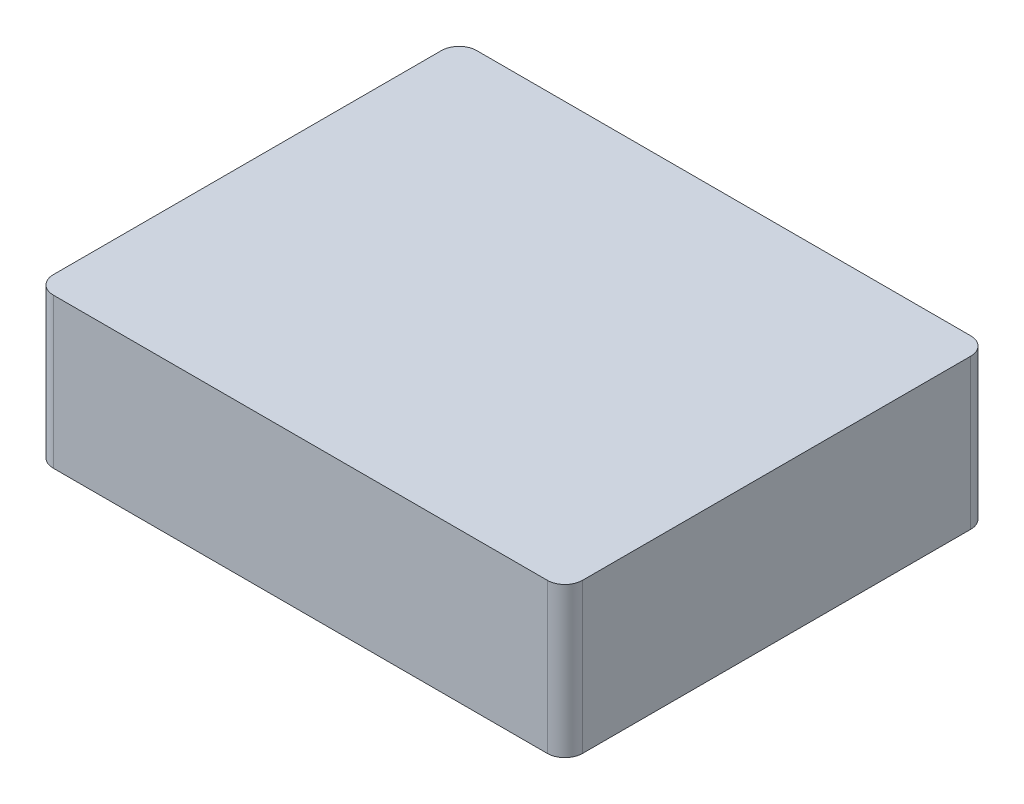
ISO-10303-21;
HEADER;
FILE_DESCRIPTION(('STEP AP214'),'2;1');
FILE_NAME('part.step','',(''),(''),'','','');
FILE_SCHEMA(('AUTOMOTIVE_DESIGN { 1 0 10303 214 1 1 1 1 }'));
ENDSEC;
DATA;
#1=APPLICATION_CONTEXT('core data for automotive mechanical design processes');
#2=APPLICATION_PROTOCOL_DEFINITION('international standard','automotive_design',2000,#1);
#3=PRODUCT_CONTEXT('',#1,'mechanical');
#4=PRODUCT('Part','Part','',(#3));
#5=PRODUCT_RELATED_PRODUCT_CATEGORY('part','',(#4));
#6=PRODUCT_DEFINITION_FORMATION('','',#4);
#7=PRODUCT_DEFINITION_CONTEXT('part definition',#1,'design');
#8=PRODUCT_DEFINITION('design','',#6,#7);
#9=PRODUCT_DEFINITION_SHAPE('','',#8);
#10=(LENGTH_UNIT() NAMED_UNIT(*) SI_UNIT(.MILLI.,.METRE.));
#11=(NAMED_UNIT(*) PLANE_ANGLE_UNIT() SI_UNIT($,.RADIAN.));
#12=(NAMED_UNIT(*) SI_UNIT($,.STERADIAN.) SOLID_ANGLE_UNIT());
#13=UNCERTAINTY_MEASURE_WITH_UNIT(LENGTH_MEASURE(1.E-05),#10,'distance_accuracy_value','');
#14=(GEOMETRIC_REPRESENTATION_CONTEXT(3) GLOBAL_UNCERTAINTY_ASSIGNED_CONTEXT((#13)) GLOBAL_UNIT_ASSIGNED_CONTEXT((#10,
#11,#12)) REPRESENTATION_CONTEXT('',''));
#15=CARTESIAN_POINT('',(0.,0.,0.));
#16=DIRECTION('',(0.,0.,1.));
#17=DIRECTION('',(1.,0.,0.));
#18=AXIS2_PLACEMENT_3D('',#15,#16,#17);
#19=CARTESIAN_POINT('',(-7.29337539432177,4.42429022082019,24.));
#20=DIRECTION('',(1.,0.,0.));
#21=DIRECTION('',(0.,0.,-1.));
#22=AXIS2_PLACEMENT_3D('',#19,#20,#21);
#23=PLANE('',#22);
#24=DIRECTION('',(0.,0.,-1.));
#25=VECTOR('',#24,1.);
#26=CARTESIAN_POINT('',(-7.29337539432177,4.42429022082019,24.));
#27=LINE('',#26,#25);
#28=CARTESIAN_POINT('',(-7.29337539432177,4.42429022082019,23.));
#29=VERTEX_POINT('',#28);
#30=CARTESIAN_POINT('',(-7.29337539432177,4.42429022082019,1.));
#31=VERTEX_POINT('',#30);
#32=EDGE_CURVE('E162',#29,#31,#27,.T.);
#33=ORIENTED_EDGE('',*,*,#32,.T.);
#34=DIRECTION('',(0.,-1.,0.));
#35=VECTOR('',#34,1.);
#36=CARTESIAN_POINT('',(-7.29337539432177,4.42429022082019,1.));
#37=LINE('',#36,#35);
#38=CARTESIAN_POINT('',(-7.29337539432177,-4.07570977917981,1.));
#39=VERTEX_POINT('',#38);
#40=EDGE_CURVE('E118',#31,#39,#37,.T.);
#41=ORIENTED_EDGE('',*,*,#40,.T.);
#42=DIRECTION('',(0.,0.,-1.));
#43=VECTOR('',#42,1.);
#44=CARTESIAN_POINT('',(-7.29337539432177,-4.07570977917981,24.));
#45=LINE('',#44,#43);
#46=CARTESIAN_POINT('',(-7.29337539432177,-4.07570977917981,23.));
#47=VERTEX_POINT('',#46);
#48=EDGE_CURVE('E102',#47,#39,#45,.T.);
#49=ORIENTED_EDGE('',*,*,#48,.F.);
#50=DIRECTION('',(0.,-1.,0.));
#51=VECTOR('',#50,1.);
#52=CARTESIAN_POINT('',(-7.29337539432177,4.42429022082019,23.));
#53=LINE('',#52,#51);
#54=EDGE_CURVE('E115',#47,#29,#53,.F.);
#55=ORIENTED_EDGE('',*,*,#54,.T.);
#56=EDGE_LOOP('',(#33,#41,#49,#55));
#57=FACE_BOUND('',#56,.T.);
#58=ADVANCED_FACE('F33',(#57),#23,.F.);
#59=CARTESIAN_POINT('',(-7.29337539432177,-4.07570977917981,24.));
#60=DIRECTION('',(0.,1.,0.));
#61=DIRECTION('',(0.,0.,1.));
#62=AXIS2_PLACEMENT_3D('',#59,#60,#61);
#63=PLANE('',#62);
#64=ORIENTED_EDGE('',*,*,#48,.T.);
#65=CARTESIAN_POINT('',(-6.29337539432177,-4.07570977917981,1.));
#66=DIRECTION('',(0.,1.,0.));
#67=DIRECTION('',(0.,0.,1.));
#68=AXIS2_PLACEMENT_3D('',#65,#66,#67);
#69=CIRCLE('',#68,1.);
#70=CARTESIAN_POINT('',(-6.29337539432177,-4.07570977917981,0.));
#71=VERTEX_POINT('',#70);
#72=EDGE_CURVE('E109',#39,#71,#69,.F.);
#73=ORIENTED_EDGE('',*,*,#72,.T.);
#74=DIRECTION('',(1.,0.,0.));
#75=VECTOR('',#74,1.);
#76=CARTESIAN_POINT('',(-7.29337539432177,-4.07570977917981,0.));
#77=LINE('',#76,#75);
#78=CARTESIAN_POINT('',(21.7066246056782,-4.07570977917981,0.));
#79=VERTEX_POINT('',#78);
#80=EDGE_CURVE('E168',#71,#79,#77,.T.);
#81=ORIENTED_EDGE('',*,*,#80,.T.);
#82=CARTESIAN_POINT('',(21.7066246056782,-4.07570977917981,1.));
#83=DIRECTION('',(0.,1.,0.));
#84=DIRECTION('',(0.,0.,1.));
#85=AXIS2_PLACEMENT_3D('',#82,#83,#84);
#86=CIRCLE('',#85,1.);
#87=CARTESIAN_POINT('',(22.7066246056782,-4.07570977917981,1.));
#88=VERTEX_POINT('',#87);
#89=EDGE_CURVE('E110',#79,#88,#86,.F.);
#90=ORIENTED_EDGE('',*,*,#89,.T.);
#91=DIRECTION('',(0.,0.,-1.));
#92=VECTOR('',#91,1.);
#93=CARTESIAN_POINT('',(22.7066246056782,-4.07570977917981,24.));
#94=LINE('',#93,#92);
#95=CARTESIAN_POINT('',(22.7066246056782,-4.07570977917981,23.));
#96=VERTEX_POINT('',#95);
#97=EDGE_CURVE('E119',#96,#88,#94,.T.);
#98=ORIENTED_EDGE('',*,*,#97,.F.);
#99=CARTESIAN_POINT('',(21.7066246056782,-4.07570977917981,23.));
#100=DIRECTION('',(0.,1.,0.));
#101=DIRECTION('',(0.,0.,1.));
#102=AXIS2_PLACEMENT_3D('',#99,#100,#101);
#103=CIRCLE('',#102,1.);
#104=CARTESIAN_POINT('',(21.7066246056782,-4.07570977917981,24.));
#105=VERTEX_POINT('',#104);
#106=EDGE_CURVE('E125',#96,#105,#103,.F.);
#107=ORIENTED_EDGE('',*,*,#106,.T.);
#108=DIRECTION('',(1.,0.,0.));
#109=VECTOR('',#108,1.);
#110=CARTESIAN_POINT('',(-7.29337539432177,-4.07570977917981,24.));
#111=LINE('',#110,#109);
#112=CARTESIAN_POINT('',(-6.29337539432177,-4.07570977917981,24.));
#113=VERTEX_POINT('',#112);
#114=EDGE_CURVE('E104',#113,#105,#111,.T.);
#115=ORIENTED_EDGE('',*,*,#114,.F.);
#116=CARTESIAN_POINT('',(-6.29337539432177,-4.07570977917981,23.));
#117=DIRECTION('',(0.,1.,0.));
#118=DIRECTION('',(0.,0.,1.));
#119=AXIS2_PLACEMENT_3D('',#116,#117,#118);
#120=CIRCLE('',#119,1.);
#121=EDGE_CURVE('E99',#113,#47,#120,.F.);
#122=ORIENTED_EDGE('',*,*,#121,.T.);
#123=EDGE_LOOP('',(#64,#73,#81,#90,#98,#107,#115,#122));
#124=FACE_BOUND('',#123,.T.);
#125=ADVANCED_FACE('F101',(#124),#63,.F.);
#126=CARTESIAN_POINT('',(22.7066246056782,4.42429022082019,24.));
#127=DIRECTION('',(-1.,0.,0.));
#128=DIRECTION('',(0.,0.,1.));
#129=AXIS2_PLACEMENT_3D('',#126,#127,#128);
#130=PLANE('',#129);
#131=ORIENTED_EDGE('',*,*,#97,.T.);
#132=DIRECTION('',(0.,1.,0.));
#133=VECTOR('',#132,1.);
#134=CARTESIAN_POINT('',(22.7066246056782,4.42429022082019,1.));
#135=LINE('',#134,#133);
#136=CARTESIAN_POINT('',(22.7066246056782,4.42429022082019,1.));
#137=VERTEX_POINT('',#136);
#138=EDGE_CURVE('E11',#88,#137,#135,.T.);
#139=ORIENTED_EDGE('',*,*,#138,.T.);
#140=DIRECTION('',(0.,0.,-1.));
#141=VECTOR('',#140,1.);
#142=CARTESIAN_POINT('',(22.7066246056782,4.42429022082019,24.));
#143=LINE('',#142,#141);
#144=CARTESIAN_POINT('',(22.7066246056782,4.42429022082019,23.));
#145=VERTEX_POINT('',#144);
#146=EDGE_CURVE('E150',#145,#137,#143,.T.);
#147=ORIENTED_EDGE('',*,*,#146,.F.);
#148=DIRECTION('',(0.,1.,0.));
#149=VECTOR('',#148,1.);
#150=CARTESIAN_POINT('',(22.7066246056782,-4.07570977917981,23.));
#151=LINE('',#150,#149);
#152=EDGE_CURVE('E41',#145,#96,#151,.F.);
#153=ORIENTED_EDGE('',*,*,#152,.T.);
#154=EDGE_LOOP('',(#131,#139,#147,#153));
#155=FACE_BOUND('',#154,.T.);
#156=ADVANCED_FACE('F149',(#155),#130,.F.);
#157=CARTESIAN_POINT('',(-7.29337539432177,4.42429022082019,24.));
#158=DIRECTION('',(0.,-1.,0.));
#159=DIRECTION('',(1.,0.,0.));
#160=AXIS2_PLACEMENT_3D('',#157,#158,#159);
#161=PLANE('',#160);
#162=DIRECTION('',(-1.,0.,0.));
#163=VECTOR('',#162,1.);
#164=CARTESIAN_POINT('',(-7.29337539432177,4.42429022082019,0.));
#165=LINE('',#164,#163);
#166=CARTESIAN_POINT('',(21.7066246056782,4.42429022082019,0.));
#167=VERTEX_POINT('',#166);
#168=CARTESIAN_POINT('',(-6.29337539432177,4.42429022082019,0.));
#169=VERTEX_POINT('',#168);
#170=EDGE_CURVE('E165',#167,#169,#165,.T.);
#171=ORIENTED_EDGE('',*,*,#170,.T.);
#172=CARTESIAN_POINT('',(-6.29337539432177,4.42429022082019,1.));
#173=DIRECTION('',(0.,-1.,0.));
#174=DIRECTION('',(1.,0.,0.));
#175=AXIS2_PLACEMENT_3D('',#172,#173,#174);
#176=CIRCLE('',#175,1.);
#177=EDGE_CURVE('E139',#169,#31,#176,.F.);
#178=ORIENTED_EDGE('',*,*,#177,.T.);
#179=ORIENTED_EDGE('',*,*,#32,.F.);
#180=CARTESIAN_POINT('',(-6.29337539432177,4.42429022082019,23.));
#181=DIRECTION('',(0.,-1.,0.));
#182=DIRECTION('',(1.,0.,0.));
#183=AXIS2_PLACEMENT_3D('',#180,#181,#182);
#184=CIRCLE('',#183,1.);
#185=CARTESIAN_POINT('',(-6.29337539432177,4.42429022082019,24.));
#186=VERTEX_POINT('',#185);
#187=EDGE_CURVE('E123',#29,#186,#184,.F.);
#188=ORIENTED_EDGE('',*,*,#187,.T.);
#189=DIRECTION('',(-1.,0.,0.));
#190=VECTOR('',#189,1.);
#191=CARTESIAN_POINT('',(-7.29337539432177,4.42429022082019,24.));
#192=LINE('',#191,#190);
#193=CARTESIAN_POINT('',(21.7066246056782,4.42429022082019,24.));
#194=VERTEX_POINT('',#193);
#195=EDGE_CURVE('E159',#194,#186,#192,.T.);
#196=ORIENTED_EDGE('',*,*,#195,.F.);
#197=CARTESIAN_POINT('',(21.7066246056782,4.42429022082019,23.));
#198=DIRECTION('',(0.,-1.,0.));
#199=DIRECTION('',(1.,0.,0.));
#200=AXIS2_PLACEMENT_3D('',#197,#198,#199);
#201=CIRCLE('',#200,1.);
#202=EDGE_CURVE('E55',#194,#145,#201,.F.);
#203=ORIENTED_EDGE('',*,*,#202,.T.);
#204=ORIENTED_EDGE('',*,*,#146,.T.);
#205=CARTESIAN_POINT('',(21.7066246056782,4.42429022082019,1.));
#206=DIRECTION('',(0.,-1.,0.));
#207=DIRECTION('',(1.,0.,0.));
#208=AXIS2_PLACEMENT_3D('',#205,#206,#207);
#209=CIRCLE('',#208,1.);
#210=EDGE_CURVE('E48',#137,#167,#209,.F.);
#211=ORIENTED_EDGE('',*,*,#210,.T.);
#212=EDGE_LOOP('',(#171,#178,#179,#188,#196,#203,#204,#211));
#213=FACE_BOUND('',#212,.T.);
#214=ADVANCED_FACE('F161',(#213),#161,.F.);
#215=CARTESIAN_POINT('',(0.,0.,24.));
#216=DIRECTION('',(0.,0.,1.));
#217=DIRECTION('',(1.,0.,0.));
#218=AXIS2_PLACEMENT_3D('',#215,#216,#217);
#219=PLANE('',#218);
#220=ORIENTED_EDGE('',*,*,#195,.T.);
#221=DIRECTION('',(0.,-1.,0.));
#222=VECTOR('',#221,1.);
#223=CARTESIAN_POINT('',(-6.29337539432177,-4.07570977917981,24.));
#224=LINE('',#223,#222);
#225=EDGE_CURVE('E144',#186,#113,#224,.T.);
#226=ORIENTED_EDGE('',*,*,#225,.T.);
#227=ORIENTED_EDGE('',*,*,#114,.T.);
#228=DIRECTION('',(0.,1.,0.));
#229=VECTOR('',#228,1.);
#230=CARTESIAN_POINT('',(21.7066246056782,4.42429022082019,24.));
#231=LINE('',#230,#229);
#232=EDGE_CURVE('E141',#105,#194,#231,.T.);
#233=ORIENTED_EDGE('',*,*,#232,.T.);
#234=EDGE_LOOP('',(#220,#226,#227,#233));
#235=FACE_BOUND('',#234,.T.);
#236=ADVANCED_FACE('F158',(#235),#219,.T.);
#237=CARTESIAN_POINT('',(0.,0.,0.));
#238=DIRECTION('',(0.,0.,1.));
#239=DIRECTION('',(1.,0.,0.));
#240=AXIS2_PLACEMENT_3D('',#237,#238,#239);
#241=PLANE('',#240);
#242=ORIENTED_EDGE('',*,*,#80,.F.);
#243=DIRECTION('',(0.,-1.,0.));
#244=VECTOR('',#243,1.);
#245=CARTESIAN_POINT('',(-6.29337539432177,0.,0.));
#246=LINE('',#245,#244);
#247=EDGE_CURVE('E134',#71,#169,#246,.F.);
#248=ORIENTED_EDGE('',*,*,#247,.T.);
#249=ORIENTED_EDGE('',*,*,#170,.F.);
#250=DIRECTION('',(0.,1.,0.));
#251=VECTOR('',#250,1.);
#252=CARTESIAN_POINT('',(21.7066246056782,0.,0.));
#253=LINE('',#252,#251);
#254=EDGE_CURVE('E132',#167,#79,#253,.F.);
#255=ORIENTED_EDGE('',*,*,#254,.T.);
#256=EDGE_LOOP('',(#242,#248,#249,#255));
#257=FACE_BOUND('',#256,.T.);
#258=ADVANCED_FACE('F175',(#257),#241,.F.);
#259=CARTESIAN_POINT('',(-6.29337539432177,4.42429022082019,1.));
#260=DIRECTION('',(0.,-1.,0.));
#261=DIRECTION('',(0.,0.,-1.));
#262=AXIS2_PLACEMENT_3D('',#259,#260,#261);
#263=CYLINDRICAL_SURFACE('',#262,1.);
#264=ORIENTED_EDGE('',*,*,#177,.F.);
#265=ORIENTED_EDGE('',*,*,#247,.F.);
#266=ORIENTED_EDGE('',*,*,#72,.F.);
#267=ORIENTED_EDGE('',*,*,#40,.F.);
#268=EDGE_LOOP('',(#264,#265,#266,#267));
#269=FACE_BOUND('',#268,.T.);
#270=ADVANCED_FACE('F183',(#269),#263,.T.);
#271=CARTESIAN_POINT('',(-6.29337539432177,0.,23.));
#272=DIRECTION('',(0.,1.,0.));
#273=DIRECTION('',(0.,0.,1.));
#274=AXIS2_PLACEMENT_3D('',#271,#272,#273);
#275=CYLINDRICAL_SURFACE('',#274,1.);
#276=ORIENTED_EDGE('',*,*,#187,.F.);
#277=ORIENTED_EDGE('',*,*,#54,.F.);
#278=ORIENTED_EDGE('',*,*,#121,.F.);
#279=ORIENTED_EDGE('',*,*,#225,.F.);
#280=EDGE_LOOP('',(#276,#277,#278,#279));
#281=FACE_BOUND('',#280,.T.);
#282=ADVANCED_FACE('F122',(#281),#275,.T.);
#283=CARTESIAN_POINT('',(21.7066246056782,4.42429022082019,1.));
#284=DIRECTION('',(0.,1.,0.));
#285=DIRECTION('',(0.,0.,1.));
#286=AXIS2_PLACEMENT_3D('',#283,#284,#285);
#287=CYLINDRICAL_SURFACE('',#286,1.);
#288=ORIENTED_EDGE('',*,*,#89,.F.);
#289=ORIENTED_EDGE('',*,*,#254,.F.);
#290=ORIENTED_EDGE('',*,*,#210,.F.);
#291=ORIENTED_EDGE('',*,*,#138,.F.);
#292=EDGE_LOOP('',(#288,#289,#290,#291));
#293=FACE_BOUND('',#292,.T.);
#294=ADVANCED_FACE('F177',(#293),#287,.T.);
#295=CARTESIAN_POINT('',(21.7066246056782,0.,23.));
#296=DIRECTION('',(0.,-1.,0.));
#297=DIRECTION('',(0.,0.,-1.));
#298=AXIS2_PLACEMENT_3D('',#295,#296,#297);
#299=CYLINDRICAL_SURFACE('',#298,1.);
#300=ORIENTED_EDGE('',*,*,#106,.F.);
#301=ORIENTED_EDGE('',*,*,#152,.F.);
#302=ORIENTED_EDGE('',*,*,#202,.F.);
#303=ORIENTED_EDGE('',*,*,#232,.F.);
#304=EDGE_LOOP('',(#300,#301,#302,#303));
#305=FACE_BOUND('',#304,.T.);
#306=ADVANCED_FACE('F35',(#305),#299,.T.);
#307=CLOSED_SHELL('',(#58,#125,#156,#214,#236,#258,#270,#282,#294,#306));
#308=MANIFOLD_SOLID_BREP('B2',#307);
#309=ADVANCED_BREP_SHAPE_REPRESENTATION('',(#18,#308),#14);
#310=SHAPE_DEFINITION_REPRESENTATION(#9,#309);
ENDSEC;
END-ISO-10303-21;
